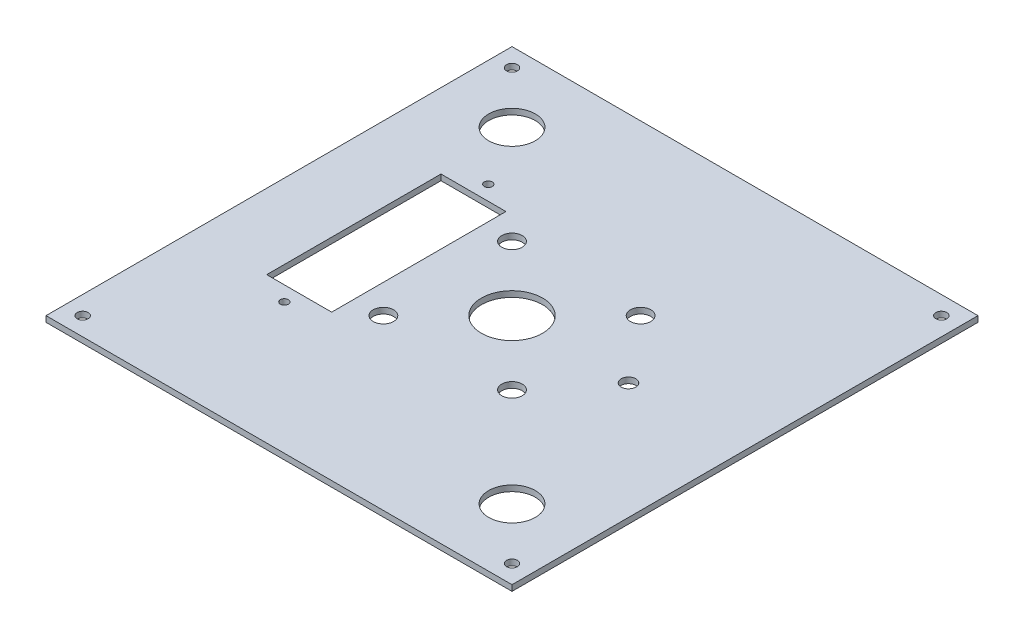
ISO-10303-21;
HEADER;
FILE_DESCRIPTION(('STEP AP214'),'2;1');
FILE_NAME('part.step','',(''),(''),'','','');
FILE_SCHEMA(('AUTOMOTIVE_DESIGN { 1 0 10303 214 1 1 1 1 }'));
ENDSEC;
DATA;
#1=APPLICATION_CONTEXT('core data for automotive mechanical design processes');
#2=APPLICATION_PROTOCOL_DEFINITION('international standard','automotive_design',2000,#1);
#3=PRODUCT_CONTEXT('',#1,'mechanical');
#4=PRODUCT('Part','Part','',(#3));
#5=PRODUCT_RELATED_PRODUCT_CATEGORY('part','',(#4));
#6=PRODUCT_DEFINITION_FORMATION('','',#4);
#7=PRODUCT_DEFINITION_CONTEXT('part definition',#1,'design');
#8=PRODUCT_DEFINITION('design','',#6,#7);
#9=PRODUCT_DEFINITION_SHAPE('','',#8);
#10=(LENGTH_UNIT() NAMED_UNIT(*) SI_UNIT(.MILLI.,.METRE.));
#11=(NAMED_UNIT(*) PLANE_ANGLE_UNIT() SI_UNIT($,.RADIAN.));
#12=(NAMED_UNIT(*) SI_UNIT($,.STERADIAN.) SOLID_ANGLE_UNIT());
#13=UNCERTAINTY_MEASURE_WITH_UNIT(LENGTH_MEASURE(1.E-05),#10,'distance_accuracy_value','');
#14=(GEOMETRIC_REPRESENTATION_CONTEXT(3) GLOBAL_UNCERTAINTY_ASSIGNED_CONTEXT((#13)) GLOBAL_UNIT_ASSIGNED_CONTEXT((#10,
#11,#12)) REPRESENTATION_CONTEXT('',''));
#15=CARTESIAN_POINT('',(0.,0.,0.));
#16=DIRECTION('',(0.,0.,1.));
#17=DIRECTION('',(1.,0.,0.));
#18=AXIS2_PLACEMENT_3D('',#15,#16,#17);
#19=CARTESIAN_POINT('',(0.,3.175,0.));
#20=DIRECTION('',(0.,-1.,0.));
#21=DIRECTION('',(0.,0.,-1.));
#22=AXIS2_PLACEMENT_3D('',#19,#20,#21);
#23=PLANE('',#22);
#24=DIRECTION('',(0.,0.,1.));
#25=VECTOR('',#24,1.);
#26=CARTESIAN_POINT('',(-86.2056878691888,3.175,0.));
#27=LINE('',#26,#25);
#28=CARTESIAN_POINT('',(-86.2056878691888,3.175,47.498));
#29=VERTEX_POINT('',#28);
#30=CARTESIAN_POINT('',(-86.2056878691888,3.175,-47.498));
#31=VERTEX_POINT('',#30);
#32=EDGE_CURVE('E495',#29,#31,#27,.F.);
#33=ORIENTED_EDGE('',*,*,#32,.T.);
#34=DIRECTION('',(-1.,0.,0.));
#35=VECTOR('',#34,1.);
#36=CARTESIAN_POINT('',(0.,3.175,-47.498));
#37=LINE('',#36,#35);
#38=CARTESIAN_POINT('',(-50.8,3.175,-47.498));
#39=VERTEX_POINT('',#38);
#40=EDGE_CURVE('E553',#31,#39,#37,.F.);
#41=ORIENTED_EDGE('',*,*,#40,.T.);
#42=DIRECTION('',(0.,0.,-1.));
#43=VECTOR('',#42,1.);
#44=CARTESIAN_POINT('',(-50.8,3.175,0.));
#45=LINE('',#44,#43);
#46=CARTESIAN_POINT('',(-50.8,3.175,47.498));
#47=VERTEX_POINT('',#46);
#48=EDGE_CURVE('E577',#39,#47,#45,.F.);
#49=ORIENTED_EDGE('',*,*,#48,.T.);
#50=DIRECTION('',(-1.,0.,0.));
#51=VECTOR('',#50,1.);
#52=CARTESIAN_POINT('',(0.,3.175,47.4979999999999));
#53=LINE('',#52,#51);
#54=EDGE_CURVE('E555',#29,#47,#53,.F.);
#55=ORIENTED_EDGE('',*,*,#54,.F.);
#56=EDGE_LOOP('',(#33,#41,#49,#55));
#57=FACE_BOUND('',#56,.T.);
#58=CARTESIAN_POINT('',(-35.052,3.175,-35.052));
#59=DIRECTION('',(0.,1.,0.));
#60=DIRECTION('',(0.,0.,1.));
#61=AXIS2_PLACEMENT_3D('',#58,#59,#60);
#62=CIRCLE('',#61,5.55625);
#63=CARTESIAN_POINT('',(-35.052,3.175,-29.49575));
#64=VERTEX_POINT('',#63);
#65=EDGE_CURVE('E211',#64,#64,#62,.F.);
#66=ORIENTED_EDGE('',*,*,#65,.T.);
#67=EDGE_LOOP('',(#66));
#68=FACE_BOUND('',#67,.T.);
#69=CARTESIAN_POINT('',(35.0519999999998,3.175,35.0520000000002));
#70=DIRECTION('',(0.,1.,0.));
#71=DIRECTION('',(0.,0.,1.));
#72=AXIS2_PLACEMENT_3D('',#69,#70,#71);
#73=CIRCLE('',#72,5.55625);
#74=CARTESIAN_POINT('',(35.0519999999998,3.175,40.6082500000002));
#75=VERTEX_POINT('',#74);
#76=EDGE_CURVE('E207',#75,#75,#73,.F.);
#77=ORIENTED_EDGE('',*,*,#76,.T.);
#78=EDGE_LOOP('',(#77));
#79=FACE_BOUND('',#78,.T.);
#80=CARTESIAN_POINT('',(-35.052,3.175,35.052));
#81=DIRECTION('',(0.,1.,0.));
#82=DIRECTION('',(0.,0.,1.));
#83=AXIS2_PLACEMENT_3D('',#80,#81,#82);
#84=CIRCLE('',#83,5.55625);
#85=CARTESIAN_POINT('',(-35.052,3.175,40.60825));
#86=VERTEX_POINT('',#85);
#87=EDGE_CURVE('E203',#86,#86,#84,.F.);
#88=ORIENTED_EDGE('',*,*,#87,.T.);
#89=EDGE_LOOP('',(#88));
#90=FACE_BOUND('',#89,.T.);
#91=CARTESIAN_POINT('',(35.0519999999998,3.175,-35.0520000000002));
#92=DIRECTION('',(0.,1.,0.));
#93=DIRECTION('',(0.,0.,1.));
#94=AXIS2_PLACEMENT_3D('',#91,#92,#93);
#95=CIRCLE('',#94,5.55625);
#96=CARTESIAN_POINT('',(35.0519999999998,3.175,-29.4957500000002));
#97=VERTEX_POINT('',#96);
#98=EDGE_CURVE('E199',#97,#97,#95,.F.);
#99=ORIENTED_EDGE('',*,*,#98,.T.);
#100=EDGE_LOOP('',(#99));
#101=FACE_BOUND('',#100,.T.);
#102=CARTESIAN_POINT('',(-116.999999999993,3.175,117.));
#103=DIRECTION('',(0.,1.,0.));
#104=DIRECTION('',(0.,0.,1.));
#105=AXIS2_PLACEMENT_3D('',#102,#103,#104);
#106=CIRCLE('',#105,2.97688);
#107=CARTESIAN_POINT('',(-116.999999999993,3.175,119.97688));
#108=VERTEX_POINT('',#107);
#109=EDGE_CURVE('E195',#108,#108,#106,.F.);
#110=ORIENTED_EDGE('',*,*,#109,.T.);
#111=EDGE_LOOP('',(#110));
#112=FACE_BOUND('',#111,.T.);
#113=CARTESIAN_POINT('',(117.000000000007,3.175,116.999999999993));
#114=DIRECTION('',(0.,1.,0.));
#115=DIRECTION('',(0.,0.,1.));
#116=AXIS2_PLACEMENT_3D('',#113,#114,#115);
#117=CIRCLE('',#116,2.97688);
#118=CARTESIAN_POINT('',(117.000000000007,3.175,119.976879999993));
#119=VERTEX_POINT('',#118);
#120=EDGE_CURVE('E191',#119,#119,#117,.F.);
#121=ORIENTED_EDGE('',*,*,#120,.T.);
#122=EDGE_LOOP('',(#121));
#123=FACE_BOUND('',#122,.T.);
#124=CARTESIAN_POINT('',(117.,3.175,-117.000000000007));
#125=DIRECTION('',(0.,1.,0.));
#126=DIRECTION('',(0.,0.,1.));
#127=AXIS2_PLACEMENT_3D('',#124,#125,#126);
#128=CIRCLE('',#127,2.97688);
#129=CARTESIAN_POINT('',(117.,3.175,-114.023120000007));
#130=VERTEX_POINT('',#129);
#131=EDGE_CURVE('E188',#130,#130,#128,.F.);
#132=ORIENTED_EDGE('',*,*,#131,.T.);
#133=EDGE_LOOP('',(#132));
#134=FACE_BOUND('',#133,.T.);
#135=CARTESIAN_POINT('',(-117.,3.175,-117.));
#136=DIRECTION('',(0.,1.,0.));
#137=DIRECTION('',(0.,0.,1.));
#138=AXIS2_PLACEMENT_3D('',#135,#136,#137);
#139=CIRCLE('',#138,2.97688);
#140=CARTESIAN_POINT('',(-117.,3.175,-114.02312));
#141=VERTEX_POINT('',#140);
#142=EDGE_CURVE('E114',#141,#141,#139,.F.);
#143=ORIENTED_EDGE('',*,*,#142,.T.);
#144=EDGE_LOOP('',(#143));
#145=FACE_BOUND('',#144,.T.);
#146=DIRECTION('',(1.,0.,0.));
#147=VECTOR('',#146,1.);
#148=CARTESIAN_POINT('',(-127.,3.175,-127.));
#149=LINE('',#148,#147);
#150=CARTESIAN_POINT('',(127.,3.175,-127.));
#151=VERTEX_POINT('',#150);
#152=CARTESIAN_POINT('',(-127.,3.175,-127.));
#153=VERTEX_POINT('',#152);
#154=EDGE_CURVE('E585',#151,#153,#149,.F.);
#155=ORIENTED_EDGE('',*,*,#154,.T.);
#156=DIRECTION('',(0.,0.,-1.));
#157=VECTOR('',#156,1.);
#158=CARTESIAN_POINT('',(-127.,3.175,127.));
#159=LINE('',#158,#157);
#160=CARTESIAN_POINT('',(-127.,3.175,127.));
#161=VERTEX_POINT('',#160);
#162=EDGE_CURVE('E94',#153,#161,#159,.F.);
#163=ORIENTED_EDGE('',*,*,#162,.T.);
#164=DIRECTION('',(-1.,0.,0.));
#165=VECTOR('',#164,1.);
#166=CARTESIAN_POINT('',(-127.,3.175,127.));
#167=LINE('',#166,#165);
#168=CARTESIAN_POINT('',(127.,3.175,127.));
#169=VERTEX_POINT('',#168);
#170=EDGE_CURVE('E96',#161,#169,#167,.F.);
#171=ORIENTED_EDGE('',*,*,#170,.T.);
#172=DIRECTION('',(0.,0.,1.));
#173=VECTOR('',#172,1.);
#174=CARTESIAN_POINT('',(127.,3.175,127.));
#175=LINE('',#174,#173);
#176=EDGE_CURVE('E99',#169,#151,#175,.F.);
#177=ORIENTED_EDGE('',*,*,#176,.T.);
#178=EDGE_LOOP('',(#155,#163,#171,#177));
#179=FACE_BOUND('',#178,.T.);
#180=CARTESIAN_POINT('',(88.8999999999998,3.175,88.9));
#181=DIRECTION('',(0.,1.,0.));
#182=DIRECTION('',(0.,0.,1.));
#183=AXIS2_PLACEMENT_3D('',#180,#181,#182);
#184=CIRCLE('',#183,12.7);
#185=CARTESIAN_POINT('',(88.8999999999998,3.175,101.6));
#186=VERTEX_POINT('',#185);
#187=EDGE_CURVE('E215',#186,#186,#184,.F.);
#188=ORIENTED_EDGE('',*,*,#187,.T.);
#189=EDGE_LOOP('',(#188));
#190=FACE_BOUND('',#189,.T.);
#191=CARTESIAN_POINT('',(-88.9,3.175,-88.8999999999999));
#192=DIRECTION('',(0.,1.,0.));
#193=DIRECTION('',(0.,0.,1.));
#194=AXIS2_PLACEMENT_3D('',#191,#192,#193);
#195=CIRCLE('',#194,12.7);
#196=CARTESIAN_POINT('',(-88.9,3.175,-76.1999999999999));
#197=VERTEX_POINT('',#196);
#198=EDGE_CURVE('E219',#197,#197,#195,.F.);
#199=ORIENTED_EDGE('',*,*,#198,.T.);
#200=EDGE_LOOP('',(#199));
#201=FACE_BOUND('',#200,.T.);
#202=CARTESIAN_POINT('',(0.,3.17500000000004,0.));
#203=DIRECTION('',(0.,1.,0.));
#204=DIRECTION('',(0.,0.,1.));
#205=AXIS2_PLACEMENT_3D('',#202,#203,#204);
#206=CIRCLE('',#205,16.66875);
#207=CARTESIAN_POINT('',(0.,3.17500000000004,16.66875));
#208=VERTEX_POINT('',#207);
#209=EDGE_CURVE('E223',#208,#208,#206,.F.);
#210=ORIENTED_EDGE('',*,*,#209,.T.);
#211=EDGE_LOOP('',(#210));
#212=FACE_BOUND('',#211,.T.);
#213=CARTESIAN_POINT('',(-68.5028439345944,3.175,55.5625));
#214=DIRECTION('',(0.,1.,0.));
#215=DIRECTION('',(0.,0.,1.));
#216=AXIS2_PLACEMENT_3D('',#213,#214,#215);
#217=CIRCLE('',#216,2.1844);
#218=CARTESIAN_POINT('',(-68.5028439345944,3.175,57.7469));
#219=VERTEX_POINT('',#218);
#220=EDGE_CURVE('E227',#219,#219,#217,.F.);
#221=ORIENTED_EDGE('',*,*,#220,.T.);
#222=EDGE_LOOP('',(#221));
#223=FACE_BOUND('',#222,.T.);
#224=CARTESIAN_POINT('',(-68.5028439345944,3.175,-55.5625));
#225=DIRECTION('',(0.,1.,0.));
#226=DIRECTION('',(0.,0.,1.));
#227=AXIS2_PLACEMENT_3D('',#224,#225,#226);
#228=CIRCLE('',#227,2.1844);
#229=CARTESIAN_POINT('',(-68.5028439345944,3.175,-53.3781));
#230=VERTEX_POINT('',#229);
#231=EDGE_CURVE('E230',#230,#230,#228,.F.);
#232=ORIENTED_EDGE('',*,*,#231,.T.);
#233=EDGE_LOOP('',(#232));
#234=FACE_BOUND('',#233,.T.);
#235=CARTESIAN_POINT('',(63.5,3.175,0.));
#236=DIRECTION('',(0.,1.,0.));
#237=DIRECTION('',(0.,0.,1.));
#238=AXIS2_PLACEMENT_3D('',#235,#236,#237);
#239=CIRCLE('',#238,3.96874999999999);
#240=CARTESIAN_POINT('',(63.5,3.175,3.96874999999999));
#241=VERTEX_POINT('',#240);
#242=EDGE_CURVE('E20',#241,#241,#239,.F.);
#243=ORIENTED_EDGE('',*,*,#242,.T.);
#244=EDGE_LOOP('',(#243));
#245=FACE_BOUND('',#244,.T.);
#246=ADVANCED_FACE('F17',(#57,#68,#79,#90,#101,#112,#123,#134,#145,#179,#190,#201,#212,#223,
#234,#245),#23,.F.);
#247=CARTESIAN_POINT('',(63.5,0.,0.));
#248=DIRECTION('',(0.,1.,0.));
#249=DIRECTION('',(0.,0.,1.));
#250=AXIS2_PLACEMENT_3D('',#247,#248,#249);
#251=CYLINDRICAL_SURFACE('',#250,3.96874999999999);
#252=ORIENTED_EDGE('',*,*,#242,.F.);
#253=EDGE_LOOP('',(#252));
#254=FACE_BOUND('',#253,.T.);
#255=CARTESIAN_POINT('',(63.5,0.,0.));
#256=DIRECTION('',(0.,1.,0.));
#257=DIRECTION('',(0.,0.,1.));
#258=AXIS2_PLACEMENT_3D('',#255,#256,#257);
#259=CIRCLE('',#258,3.96874999999999);
#260=CARTESIAN_POINT('',(63.5,0.,3.96874999999999));
#261=VERTEX_POINT('',#260);
#262=EDGE_CURVE('E181',#261,#261,#259,.T.);
#263=ORIENTED_EDGE('',*,*,#262,.F.);
#264=EDGE_LOOP('',(#263));
#265=FACE_BOUND('',#264,.T.);
#266=ADVANCED_FACE('F240',(#254,#265),#251,.F.);
#267=CARTESIAN_POINT('',(-68.5028439345944,0.,-55.5625));
#268=DIRECTION('',(0.,1.,0.));
#269=DIRECTION('',(0.,0.,1.));
#270=AXIS2_PLACEMENT_3D('',#267,#268,#269);
#271=CYLINDRICAL_SURFACE('',#270,2.1844);
#272=ORIENTED_EDGE('',*,*,#231,.F.);
#273=EDGE_LOOP('',(#272));
#274=FACE_BOUND('',#273,.T.);
#275=CARTESIAN_POINT('',(-68.5028439345944,0.,-55.5625));
#276=DIRECTION('',(0.,1.,0.));
#277=DIRECTION('',(0.,0.,1.));
#278=AXIS2_PLACEMENT_3D('',#275,#276,#277);
#279=CIRCLE('',#278,2.1844);
#280=CARTESIAN_POINT('',(-68.5028439345944,0.,-53.3781));
#281=VERTEX_POINT('',#280);
#282=EDGE_CURVE('E177',#281,#281,#279,.T.);
#283=ORIENTED_EDGE('',*,*,#282,.F.);
#284=EDGE_LOOP('',(#283));
#285=FACE_BOUND('',#284,.T.);
#286=ADVANCED_FACE('F243',(#274,#285),#271,.F.);
#287=CARTESIAN_POINT('',(-68.5028439345944,0.,55.5625));
#288=DIRECTION('',(0.,1.,0.));
#289=DIRECTION('',(0.,0.,1.));
#290=AXIS2_PLACEMENT_3D('',#287,#288,#289);
#291=CYLINDRICAL_SURFACE('',#290,2.1844);
#292=ORIENTED_EDGE('',*,*,#220,.F.);
#293=EDGE_LOOP('',(#292));
#294=FACE_BOUND('',#293,.T.);
#295=CARTESIAN_POINT('',(-68.5028439345944,0.,55.5625));
#296=DIRECTION('',(0.,1.,0.));
#297=DIRECTION('',(0.,0.,1.));
#298=AXIS2_PLACEMENT_3D('',#295,#296,#297);
#299=CIRCLE('',#298,2.1844);
#300=CARTESIAN_POINT('',(-68.5028439345944,0.,57.7469));
#301=VERTEX_POINT('',#300);
#302=EDGE_CURVE('E173',#301,#301,#299,.T.);
#303=ORIENTED_EDGE('',*,*,#302,.F.);
#304=EDGE_LOOP('',(#303));
#305=FACE_BOUND('',#304,.T.);
#306=ADVANCED_FACE('F326',(#294,#305),#291,.F.);
#307=CARTESIAN_POINT('',(0.,-504.825,0.));
#308=DIRECTION('',(0.,1.,0.));
#309=DIRECTION('',(0.,0.,1.));
#310=AXIS2_PLACEMENT_3D('',#307,#308,#309);
#311=CYLINDRICAL_SURFACE('',#310,16.66875);
#312=CARTESIAN_POINT('',(0.,0.,0.));
#313=DIRECTION('',(0.,1.,0.));
#314=DIRECTION('',(0.,0.,1.));
#315=AXIS2_PLACEMENT_3D('',#312,#313,#314);
#316=CIRCLE('',#315,16.66875);
#317=CARTESIAN_POINT('',(0.,0.,16.66875));
#318=VERTEX_POINT('',#317);
#319=EDGE_CURVE('E169',#318,#318,#316,.T.);
#320=ORIENTED_EDGE('',*,*,#319,.F.);
#321=EDGE_LOOP('',(#320));
#322=FACE_BOUND('',#321,.T.);
#323=ORIENTED_EDGE('',*,*,#209,.F.);
#324=EDGE_LOOP('',(#323));
#325=FACE_BOUND('',#324,.T.);
#326=ADVANCED_FACE('F322',(#322,#325),#311,.F.);
#327=CARTESIAN_POINT('',(-88.9,0.,-88.8999999999999));
#328=DIRECTION('',(0.,1.,0.));
#329=DIRECTION('',(0.,0.,1.));
#330=AXIS2_PLACEMENT_3D('',#327,#328,#329);
#331=CYLINDRICAL_SURFACE('',#330,12.7);
#332=ORIENTED_EDGE('',*,*,#198,.F.);
#333=EDGE_LOOP('',(#332));
#334=FACE_BOUND('',#333,.T.);
#335=CARTESIAN_POINT('',(-88.9,0.,-88.8999999999999));
#336=DIRECTION('',(0.,1.,0.));
#337=DIRECTION('',(0.,0.,1.));
#338=AXIS2_PLACEMENT_3D('',#335,#336,#337);
#339=CIRCLE('',#338,12.7);
#340=CARTESIAN_POINT('',(-88.9,0.,-76.1999999999999));
#341=VERTEX_POINT('',#340);
#342=EDGE_CURVE('E165',#341,#341,#339,.T.);
#343=ORIENTED_EDGE('',*,*,#342,.F.);
#344=EDGE_LOOP('',(#343));
#345=FACE_BOUND('',#344,.T.);
#346=ADVANCED_FACE('F318',(#334,#345),#331,.F.);
#347=CARTESIAN_POINT('',(88.8999999999998,0.,88.9));
#348=DIRECTION('',(0.,1.,0.));
#349=DIRECTION('',(0.,0.,1.));
#350=AXIS2_PLACEMENT_3D('',#347,#348,#349);
#351=CYLINDRICAL_SURFACE('',#350,12.7);
#352=ORIENTED_EDGE('',*,*,#187,.F.);
#353=EDGE_LOOP('',(#352));
#354=FACE_BOUND('',#353,.T.);
#355=CARTESIAN_POINT('',(88.8999999999998,0.,88.9));
#356=DIRECTION('',(0.,1.,0.));
#357=DIRECTION('',(0.,0.,1.));
#358=AXIS2_PLACEMENT_3D('',#355,#356,#357);
#359=CIRCLE('',#358,12.7);
#360=CARTESIAN_POINT('',(88.8999999999998,0.,101.6));
#361=VERTEX_POINT('',#360);
#362=EDGE_CURVE('E161',#361,#361,#359,.T.);
#363=ORIENTED_EDGE('',*,*,#362,.F.);
#364=EDGE_LOOP('',(#363));
#365=FACE_BOUND('',#364,.T.);
#366=ADVANCED_FACE('F314',(#354,#365),#351,.F.);
#367=CARTESIAN_POINT('',(-35.052,0.,-35.052));
#368=DIRECTION('',(0.,1.,0.));
#369=DIRECTION('',(0.,0.,1.));
#370=AXIS2_PLACEMENT_3D('',#367,#368,#369);
#371=CYLINDRICAL_SURFACE('',#370,5.55625);
#372=ORIENTED_EDGE('',*,*,#65,.F.);
#373=EDGE_LOOP('',(#372));
#374=FACE_BOUND('',#373,.T.);
#375=CARTESIAN_POINT('',(-35.052,0.,-35.052));
#376=DIRECTION('',(0.,1.,0.));
#377=DIRECTION('',(0.,0.,1.));
#378=AXIS2_PLACEMENT_3D('',#375,#376,#377);
#379=CIRCLE('',#378,5.55625);
#380=CARTESIAN_POINT('',(-35.052,0.,-29.49575));
#381=VERTEX_POINT('',#380);
#382=EDGE_CURVE('E157',#381,#381,#379,.T.);
#383=ORIENTED_EDGE('',*,*,#382,.F.);
#384=EDGE_LOOP('',(#383));
#385=FACE_BOUND('',#384,.T.);
#386=ADVANCED_FACE('F310',(#374,#385),#371,.F.);
#387=CARTESIAN_POINT('',(35.0519999999998,0.,35.0520000000002));
#388=DIRECTION('',(0.,1.,0.));
#389=DIRECTION('',(0.,0.,1.));
#390=AXIS2_PLACEMENT_3D('',#387,#388,#389);
#391=CYLINDRICAL_SURFACE('',#390,5.55625);
#392=ORIENTED_EDGE('',*,*,#76,.F.);
#393=EDGE_LOOP('',(#392));
#394=FACE_BOUND('',#393,.T.);
#395=CARTESIAN_POINT('',(35.0519999999998,0.,35.0520000000002));
#396=DIRECTION('',(0.,1.,0.));
#397=DIRECTION('',(0.,0.,1.));
#398=AXIS2_PLACEMENT_3D('',#395,#396,#397);
#399=CIRCLE('',#398,5.55625);
#400=CARTESIAN_POINT('',(35.0519999999998,0.,40.6082500000002));
#401=VERTEX_POINT('',#400);
#402=EDGE_CURVE('E153',#401,#401,#399,.T.);
#403=ORIENTED_EDGE('',*,*,#402,.F.);
#404=EDGE_LOOP('',(#403));
#405=FACE_BOUND('',#404,.T.);
#406=ADVANCED_FACE('F306',(#394,#405),#391,.F.);
#407=CARTESIAN_POINT('',(-35.052,0.,35.052));
#408=DIRECTION('',(0.,1.,0.));
#409=DIRECTION('',(0.,0.,1.));
#410=AXIS2_PLACEMENT_3D('',#407,#408,#409);
#411=CYLINDRICAL_SURFACE('',#410,5.55625);
#412=ORIENTED_EDGE('',*,*,#87,.F.);
#413=EDGE_LOOP('',(#412));
#414=FACE_BOUND('',#413,.T.);
#415=CARTESIAN_POINT('',(-35.052,0.,35.052));
#416=DIRECTION('',(0.,1.,0.));
#417=DIRECTION('',(0.,0.,1.));
#418=AXIS2_PLACEMENT_3D('',#415,#416,#417);
#419=CIRCLE('',#418,5.55625);
#420=CARTESIAN_POINT('',(-35.052,0.,40.60825));
#421=VERTEX_POINT('',#420);
#422=EDGE_CURVE('E149',#421,#421,#419,.T.);
#423=ORIENTED_EDGE('',*,*,#422,.F.);
#424=EDGE_LOOP('',(#423));
#425=FACE_BOUND('',#424,.T.);
#426=ADVANCED_FACE('F302',(#414,#425),#411,.F.);
#427=CARTESIAN_POINT('',(35.0519999999998,0.,-35.0520000000002));
#428=DIRECTION('',(0.,1.,0.));
#429=DIRECTION('',(0.,0.,1.));
#430=AXIS2_PLACEMENT_3D('',#427,#428,#429);
#431=CYLINDRICAL_SURFACE('',#430,5.55625);
#432=ORIENTED_EDGE('',*,*,#98,.F.);
#433=EDGE_LOOP('',(#432));
#434=FACE_BOUND('',#433,.T.);
#435=CARTESIAN_POINT('',(35.0519999999998,0.,-35.0520000000002));
#436=DIRECTION('',(0.,1.,0.));
#437=DIRECTION('',(0.,0.,1.));
#438=AXIS2_PLACEMENT_3D('',#435,#436,#437);
#439=CIRCLE('',#438,5.55625);
#440=CARTESIAN_POINT('',(35.0519999999998,0.,-29.4957500000002));
#441=VERTEX_POINT('',#440);
#442=EDGE_CURVE('E145',#441,#441,#439,.T.);
#443=ORIENTED_EDGE('',*,*,#442,.F.);
#444=EDGE_LOOP('',(#443));
#445=FACE_BOUND('',#444,.T.);
#446=ADVANCED_FACE('F298',(#434,#445),#431,.F.);
#447=CARTESIAN_POINT('',(-116.999999999993,0.,117.));
#448=DIRECTION('',(0.,1.,0.));
#449=DIRECTION('',(0.,0.,1.));
#450=AXIS2_PLACEMENT_3D('',#447,#448,#449);
#451=CYLINDRICAL_SURFACE('',#450,2.97688);
#452=ORIENTED_EDGE('',*,*,#109,.F.);
#453=EDGE_LOOP('',(#452));
#454=FACE_BOUND('',#453,.T.);
#455=CARTESIAN_POINT('',(-116.999999999993,0.,117.));
#456=DIRECTION('',(0.,1.,0.));
#457=DIRECTION('',(0.,0.,1.));
#458=AXIS2_PLACEMENT_3D('',#455,#456,#457);
#459=CIRCLE('',#458,2.97688);
#460=CARTESIAN_POINT('',(-116.999999999993,0.,119.97688));
#461=VERTEX_POINT('',#460);
#462=EDGE_CURVE('E141',#461,#461,#459,.T.);
#463=ORIENTED_EDGE('',*,*,#462,.F.);
#464=EDGE_LOOP('',(#463));
#465=FACE_BOUND('',#464,.T.);
#466=ADVANCED_FACE('F294',(#454,#465),#451,.F.);
#467=CARTESIAN_POINT('',(117.000000000007,0.,116.999999999993));
#468=DIRECTION('',(0.,1.,0.));
#469=DIRECTION('',(0.,0.,1.));
#470=AXIS2_PLACEMENT_3D('',#467,#468,#469);
#471=CYLINDRICAL_SURFACE('',#470,2.97688);
#472=ORIENTED_EDGE('',*,*,#120,.F.);
#473=EDGE_LOOP('',(#472));
#474=FACE_BOUND('',#473,.T.);
#475=CARTESIAN_POINT('',(117.000000000007,0.,116.999999999993));
#476=DIRECTION('',(0.,1.,0.));
#477=DIRECTION('',(0.,0.,1.));
#478=AXIS2_PLACEMENT_3D('',#475,#476,#477);
#479=CIRCLE('',#478,2.97688);
#480=CARTESIAN_POINT('',(117.000000000007,0.,119.976879999993));
#481=VERTEX_POINT('',#480);
#482=EDGE_CURVE('E137',#481,#481,#479,.T.);
#483=ORIENTED_EDGE('',*,*,#482,.F.);
#484=EDGE_LOOP('',(#483));
#485=FACE_BOUND('',#484,.T.);
#486=ADVANCED_FACE('F290',(#474,#485),#471,.F.);
#487=CARTESIAN_POINT('',(117.,0.,-117.000000000007));
#488=DIRECTION('',(0.,1.,0.));
#489=DIRECTION('',(0.,0.,1.));
#490=AXIS2_PLACEMENT_3D('',#487,#488,#489);
#491=CYLINDRICAL_SURFACE('',#490,2.97688);
#492=ORIENTED_EDGE('',*,*,#131,.F.);
#493=EDGE_LOOP('',(#492));
#494=FACE_BOUND('',#493,.T.);
#495=CARTESIAN_POINT('',(117.,0.,-117.000000000007));
#496=DIRECTION('',(0.,1.,0.));
#497=DIRECTION('',(0.,0.,1.));
#498=AXIS2_PLACEMENT_3D('',#495,#496,#497);
#499=CIRCLE('',#498,2.97688);
#500=CARTESIAN_POINT('',(117.,0.,-114.023120000007));
#501=VERTEX_POINT('',#500);
#502=EDGE_CURVE('E134',#501,#501,#499,.T.);
#503=ORIENTED_EDGE('',*,*,#502,.F.);
#504=EDGE_LOOP('',(#503));
#505=FACE_BOUND('',#504,.T.);
#506=ADVANCED_FACE('F286',(#494,#505),#491,.F.);
#507=CARTESIAN_POINT('',(-117.,0.,-117.));
#508=DIRECTION('',(0.,1.,0.));
#509=DIRECTION('',(0.,0.,1.));
#510=AXIS2_PLACEMENT_3D('',#507,#508,#509);
#511=CYLINDRICAL_SURFACE('',#510,2.97688);
#512=ORIENTED_EDGE('',*,*,#142,.F.);
#513=EDGE_LOOP('',(#512));
#514=FACE_BOUND('',#513,.T.);
#515=CARTESIAN_POINT('',(-117.,0.,-117.));
#516=DIRECTION('',(0.,1.,0.));
#517=DIRECTION('',(0.,0.,1.));
#518=AXIS2_PLACEMENT_3D('',#515,#516,#517);
#519=CIRCLE('',#518,2.97688);
#520=CARTESIAN_POINT('',(-117.,0.,-114.02312));
#521=VERTEX_POINT('',#520);
#522=EDGE_CURVE('E129',#521,#521,#519,.T.);
#523=ORIENTED_EDGE('',*,*,#522,.F.);
#524=EDGE_LOOP('',(#523));
#525=FACE_BOUND('',#524,.T.);
#526=ADVANCED_FACE('F283',(#514,#525),#511,.F.);
#527=CARTESIAN_POINT('',(127.,3.175,127.));
#528=DIRECTION('',(-1.,0.,0.));
#529=DIRECTION('',(0.,0.,1.));
#530=AXIS2_PLACEMENT_3D('',#527,#528,#529);
#531=PLANE('',#530);
#532=DIRECTION('',(0.,1.,0.));
#533=VECTOR('',#532,1.);
#534=CARTESIAN_POINT('',(127.,3.175,-127.));
#535=LINE('',#534,#533);
#536=CARTESIAN_POINT('',(127.,0.,-127.));
#537=VERTEX_POINT('',#536);
#538=EDGE_CURVE('E111',#537,#151,#535,.T.);
#539=ORIENTED_EDGE('',*,*,#538,.T.);
#540=ORIENTED_EDGE('',*,*,#176,.F.);
#541=DIRECTION('',(0.,1.,0.));
#542=VECTOR('',#541,1.);
#543=CARTESIAN_POINT('',(127.,3.175,127.));
#544=LINE('',#543,#542);
#545=CARTESIAN_POINT('',(127.,0.,127.));
#546=VERTEX_POINT('',#545);
#547=EDGE_CURVE('E105',#169,#546,#544,.F.);
#548=ORIENTED_EDGE('',*,*,#547,.T.);
#549=DIRECTION('',(0.,0.,-1.));
#550=VECTOR('',#549,1.);
#551=CARTESIAN_POINT('',(127.,0.,0.));
#552=LINE('',#551,#550);
#553=EDGE_CURVE('E133',#537,#546,#552,.F.);
#554=ORIENTED_EDGE('',*,*,#553,.F.);
#555=EDGE_LOOP('',(#539,#540,#548,#554));
#556=FACE_BOUND('',#555,.T.);
#557=ADVANCED_FACE('F108',(#556),#531,.F.);
#558=CARTESIAN_POINT('',(-127.,3.175,127.));
#559=DIRECTION('',(0.,0.,-1.));
#560=DIRECTION('',(-1.,0.,0.));
#561=AXIS2_PLACEMENT_3D('',#558,#559,#560);
#562=PLANE('',#561);
#563=ORIENTED_EDGE('',*,*,#547,.F.);
#564=ORIENTED_EDGE('',*,*,#170,.F.);
#565=DIRECTION('',(0.,1.,0.));
#566=VECTOR('',#565,1.);
#567=CARTESIAN_POINT('',(-127.,3.175,127.));
#568=LINE('',#567,#566);
#569=CARTESIAN_POINT('',(-127.,0.,127.));
#570=VERTEX_POINT('',#569);
#571=EDGE_CURVE('E125',#161,#570,#568,.F.);
#572=ORIENTED_EDGE('',*,*,#571,.T.);
#573=DIRECTION('',(1.,0.,0.));
#574=VECTOR('',#573,1.);
#575=CARTESIAN_POINT('',(0.,0.,127.));
#576=LINE('',#575,#574);
#577=EDGE_CURVE('E118',#546,#570,#576,.F.);
#578=ORIENTED_EDGE('',*,*,#577,.F.);
#579=EDGE_LOOP('',(#563,#564,#572,#578));
#580=FACE_BOUND('',#579,.T.);
#581=ADVANCED_FACE('F116',(#580),#562,.F.);
#582=CARTESIAN_POINT('',(-127.,3.175,127.));
#583=DIRECTION('',(1.,0.,0.));
#584=DIRECTION('',(0.,0.,-1.));
#585=AXIS2_PLACEMENT_3D('',#582,#583,#584);
#586=PLANE('',#585);
#587=ORIENTED_EDGE('',*,*,#571,.F.);
#588=ORIENTED_EDGE('',*,*,#162,.F.);
#589=DIRECTION('',(0.,1.,0.));
#590=VECTOR('',#589,1.);
#591=CARTESIAN_POINT('',(-127.,3.175,-127.));
#592=LINE('',#591,#590);
#593=CARTESIAN_POINT('',(-127.,0.,-127.));
#594=VERTEX_POINT('',#593);
#595=EDGE_CURVE('E559',#153,#594,#592,.F.);
#596=ORIENTED_EDGE('',*,*,#595,.T.);
#597=DIRECTION('',(0.,0.,-1.));
#598=VECTOR('',#597,1.);
#599=CARTESIAN_POINT('',(-127.,0.,0.));
#600=LINE('',#599,#598);
#601=EDGE_CURVE('E592',#570,#594,#600,.T.);
#602=ORIENTED_EDGE('',*,*,#601,.F.);
#603=EDGE_LOOP('',(#587,#588,#596,#602));
#604=FACE_BOUND('',#603,.T.);
#605=ADVANCED_FACE('F274',(#604),#586,.F.);
#606=CARTESIAN_POINT('',(-127.,3.175,-127.));
#607=DIRECTION('',(0.,0.,1.));
#608=DIRECTION('',(1.,0.,0.));
#609=AXIS2_PLACEMENT_3D('',#606,#607,#608);
#610=PLANE('',#609);
#611=ORIENTED_EDGE('',*,*,#595,.F.);
#612=ORIENTED_EDGE('',*,*,#154,.F.);
#613=ORIENTED_EDGE('',*,*,#538,.F.);
#614=DIRECTION('',(1.,0.,0.));
#615=VECTOR('',#614,1.);
#616=CARTESIAN_POINT('',(0.,0.,-127.));
#617=LINE('',#616,#615);
#618=EDGE_CURVE('E596',#594,#537,#617,.T.);
#619=ORIENTED_EDGE('',*,*,#618,.F.);
#620=EDGE_LOOP('',(#611,#612,#613,#619));
#621=FACE_BOUND('',#620,.T.);
#622=ADVANCED_FACE('F270',(#621),#610,.F.);
#623=CARTESIAN_POINT('',(-86.2056878691888,-22.225,0.));
#624=DIRECTION('',(-1.,0.,0.));
#625=DIRECTION('',(0.,0.,1.));
#626=AXIS2_PLACEMENT_3D('',#623,#624,#625);
#627=PLANE('',#626);
#628=DIRECTION('',(0.,1.,0.));
#629=VECTOR('',#628,1.);
#630=CARTESIAN_POINT('',(-86.2056878691888,-22.225,-47.498));
#631=LINE('',#630,#629);
#632=CARTESIAN_POINT('',(-86.2056878691888,0.,-47.498));
#633=VERTEX_POINT('',#632);
#634=EDGE_CURVE('E562',#633,#31,#631,.T.);
#635=ORIENTED_EDGE('',*,*,#634,.T.);
#636=ORIENTED_EDGE('',*,*,#32,.F.);
#637=DIRECTION('',(0.,1.,0.));
#638=VECTOR('',#637,1.);
#639=CARTESIAN_POINT('',(-86.2056878691888,-22.225,47.498));
#640=LINE('',#639,#638);
#641=CARTESIAN_POINT('',(-86.2056878691888,0.,47.498));
#642=VERTEX_POINT('',#641);
#643=EDGE_CURVE('E558',#642,#29,#640,.T.);
#644=ORIENTED_EDGE('',*,*,#643,.F.);
#645=DIRECTION('',(0.,0.,-1.));
#646=VECTOR('',#645,1.);
#647=CARTESIAN_POINT('',(-86.2056878691888,0.,0.));
#648=LINE('',#647,#646);
#649=EDGE_CURVE('E564',#633,#642,#648,.F.);
#650=ORIENTED_EDGE('',*,*,#649,.F.);
#651=EDGE_LOOP('',(#635,#636,#644,#650));
#652=FACE_BOUND('',#651,.T.);
#653=ADVANCED_FACE('F266',(#652),#627,.F.);
#654=CARTESIAN_POINT('',(0.,-22.225,47.4979999999999));
#655=DIRECTION('',(0.,0.,-1.));
#656=DIRECTION('',(-1.,0.,0.));
#657=AXIS2_PLACEMENT_3D('',#654,#655,#656);
#658=PLANE('',#657);
#659=DIRECTION('',(0.,1.,0.));
#660=VECTOR('',#659,1.);
#661=CARTESIAN_POINT('',(-50.8,-22.225,47.498));
#662=LINE('',#661,#660);
#663=CARTESIAN_POINT('',(-50.8,0.,47.498));
#664=VERTEX_POINT('',#663);
#665=EDGE_CURVE('E566',#47,#664,#662,.F.);
#666=ORIENTED_EDGE('',*,*,#665,.T.);
#667=DIRECTION('',(1.,0.,0.));
#668=VECTOR('',#667,1.);
#669=CARTESIAN_POINT('',(0.,0.,47.498));
#670=LINE('',#669,#668);
#671=EDGE_CURVE('E604',#642,#664,#670,.T.);
#672=ORIENTED_EDGE('',*,*,#671,.F.);
#673=ORIENTED_EDGE('',*,*,#643,.T.);
#674=ORIENTED_EDGE('',*,*,#54,.T.);
#675=EDGE_LOOP('',(#666,#672,#673,#674));
#676=FACE_BOUND('',#675,.T.);
#677=ADVANCED_FACE('F263',(#676),#658,.T.);
#678=CARTESIAN_POINT('',(-50.8,-22.225,0.));
#679=DIRECTION('',(1.,0.,0.));
#680=DIRECTION('',(0.,0.,-1.));
#681=AXIS2_PLACEMENT_3D('',#678,#679,#680);
#682=PLANE('',#681);
#683=ORIENTED_EDGE('',*,*,#665,.F.);
#684=ORIENTED_EDGE('',*,*,#48,.F.);
#685=DIRECTION('',(0.,1.,0.));
#686=VECTOR('',#685,1.);
#687=CARTESIAN_POINT('',(-50.8,-22.225,-47.498));
#688=LINE('',#687,#686);
#689=CARTESIAN_POINT('',(-50.8,0.,-47.498));
#690=VERTEX_POINT('',#689);
#691=EDGE_CURVE('E40',#39,#690,#688,.F.);
#692=ORIENTED_EDGE('',*,*,#691,.T.);
#693=DIRECTION('',(0.,0.,-1.));
#694=VECTOR('',#693,1.);
#695=CARTESIAN_POINT('',(-50.8,0.,0.));
#696=LINE('',#695,#694);
#697=EDGE_CURVE('E27',#664,#690,#696,.T.);
#698=ORIENTED_EDGE('',*,*,#697,.F.);
#699=EDGE_LOOP('',(#683,#684,#692,#698));
#700=FACE_BOUND('',#699,.T.);
#701=ADVANCED_FACE('F255',(#700),#682,.F.);
#702=CARTESIAN_POINT('',(0.,-22.225,-47.498));
#703=DIRECTION('',(0.,0.,-1.));
#704=DIRECTION('',(-1.,0.,0.));
#705=AXIS2_PLACEMENT_3D('',#702,#703,#704);
#706=PLANE('',#705);
#707=ORIENTED_EDGE('',*,*,#691,.F.);
#708=ORIENTED_EDGE('',*,*,#40,.F.);
#709=ORIENTED_EDGE('',*,*,#634,.F.);
#710=DIRECTION('',(1.,0.,0.));
#711=VECTOR('',#710,1.);
#712=CARTESIAN_POINT('',(0.,0.,-47.498));
#713=LINE('',#712,#711);
#714=EDGE_CURVE('E11',#690,#633,#713,.F.);
#715=ORIENTED_EDGE('',*,*,#714,.F.);
#716=EDGE_LOOP('',(#707,#708,#709,#715));
#717=FACE_BOUND('',#716,.T.);
#718=ADVANCED_FACE('F248',(#717),#706,.F.);
#719=CARTESIAN_POINT('',(0.,0.,0.));
#720=DIRECTION('',(0.,-1.,0.));
#721=DIRECTION('',(0.,0.,-1.));
#722=AXIS2_PLACEMENT_3D('',#719,#720,#721);
#723=PLANE('',#722);
#724=ORIENTED_EDGE('',*,*,#697,.T.);
#725=ORIENTED_EDGE('',*,*,#714,.T.);
#726=ORIENTED_EDGE('',*,*,#649,.T.);
#727=ORIENTED_EDGE('',*,*,#671,.T.);
#728=EDGE_LOOP('',(#724,#725,#726,#727));
#729=FACE_BOUND('',#728,.T.);
#730=ORIENTED_EDGE('',*,*,#601,.T.);
#731=ORIENTED_EDGE('',*,*,#618,.T.);
#732=ORIENTED_EDGE('',*,*,#553,.T.);
#733=ORIENTED_EDGE('',*,*,#577,.T.);
#734=EDGE_LOOP('',(#730,#731,#732,#733));
#735=FACE_BOUND('',#734,.T.);
#736=ORIENTED_EDGE('',*,*,#522,.T.);
#737=EDGE_LOOP('',(#736));
#738=FACE_BOUND('',#737,.T.);
#739=ORIENTED_EDGE('',*,*,#502,.T.);
#740=EDGE_LOOP('',(#739));
#741=FACE_BOUND('',#740,.T.);
#742=ORIENTED_EDGE('',*,*,#482,.T.);
#743=EDGE_LOOP('',(#742));
#744=FACE_BOUND('',#743,.T.);
#745=ORIENTED_EDGE('',*,*,#462,.T.);
#746=EDGE_LOOP('',(#745));
#747=FACE_BOUND('',#746,.T.);
#748=ORIENTED_EDGE('',*,*,#442,.T.);
#749=EDGE_LOOP('',(#748));
#750=FACE_BOUND('',#749,.T.);
#751=ORIENTED_EDGE('',*,*,#422,.T.);
#752=EDGE_LOOP('',(#751));
#753=FACE_BOUND('',#752,.T.);
#754=ORIENTED_EDGE('',*,*,#402,.T.);
#755=EDGE_LOOP('',(#754));
#756=FACE_BOUND('',#755,.T.);
#757=ORIENTED_EDGE('',*,*,#382,.T.);
#758=EDGE_LOOP('',(#757));
#759=FACE_BOUND('',#758,.T.);
#760=ORIENTED_EDGE('',*,*,#362,.T.);
#761=EDGE_LOOP('',(#760));
#762=FACE_BOUND('',#761,.T.);
#763=ORIENTED_EDGE('',*,*,#342,.T.);
#764=EDGE_LOOP('',(#763));
#765=FACE_BOUND('',#764,.T.);
#766=ORIENTED_EDGE('',*,*,#319,.T.);
#767=EDGE_LOOP('',(#766));
#768=FACE_BOUND('',#767,.T.);
#769=ORIENTED_EDGE('',*,*,#302,.T.);
#770=EDGE_LOOP('',(#769));
#771=FACE_BOUND('',#770,.T.);
#772=ORIENTED_EDGE('',*,*,#282,.T.);
#773=EDGE_LOOP('',(#772));
#774=FACE_BOUND('',#773,.T.);
#775=ORIENTED_EDGE('',*,*,#262,.T.);
#776=EDGE_LOOP('',(#775));
#777=FACE_BOUND('',#776,.T.);
#778=ADVANCED_FACE('F246',(#729,#735,#738,#741,#744,#747,#750,#753,#756,#759,#762,#765,#768,
#771,#774,#777),#723,.T.);
#779=CLOSED_SHELL('',(#246,#266,#286,#306,#326,#346,#366,#386,#406,#426,#446,#466,#486,#506,
#526,#557,#581,#605,#622,#653,#677,#701,#718,#778));
#780=MANIFOLD_SOLID_BREP('B1',#779);
#781=ADVANCED_BREP_SHAPE_REPRESENTATION('',(#18,#780),#14);
#782=SHAPE_DEFINITION_REPRESENTATION(#9,#781);
ENDSEC;
END-ISO-10303-21;
